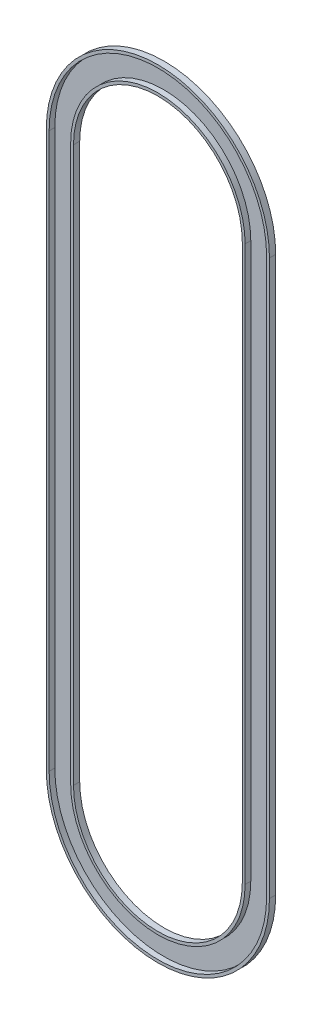
ISO-10303-21;
HEADER;
FILE_DESCRIPTION(('STEP AP214'),'2;1');
FILE_NAME('part.step','',(''),(''),'','','');
FILE_SCHEMA(('AUTOMOTIVE_DESIGN { 1 0 10303 214 1 1 1 1 }'));
ENDSEC;
DATA;
#1=APPLICATION_CONTEXT('core data for automotive mechanical design processes');
#2=APPLICATION_PROTOCOL_DEFINITION('international standard','automotive_design',2000,#1);
#3=PRODUCT_CONTEXT('',#1,'mechanical');
#4=PRODUCT('Part','Part','',(#3));
#5=PRODUCT_RELATED_PRODUCT_CATEGORY('part','',(#4));
#6=PRODUCT_DEFINITION_FORMATION('','',#4);
#7=PRODUCT_DEFINITION_CONTEXT('part definition',#1,'design');
#8=PRODUCT_DEFINITION('design','',#6,#7);
#9=PRODUCT_DEFINITION_SHAPE('','',#8);
#10=(LENGTH_UNIT() NAMED_UNIT(*) SI_UNIT(.MILLI.,.METRE.));
#11=(NAMED_UNIT(*) PLANE_ANGLE_UNIT() SI_UNIT($,.RADIAN.));
#12=(NAMED_UNIT(*) SI_UNIT($,.STERADIAN.) SOLID_ANGLE_UNIT());
#13=UNCERTAINTY_MEASURE_WITH_UNIT(LENGTH_MEASURE(1.E-05),#10,'distance_accuracy_value','');
#14=(GEOMETRIC_REPRESENTATION_CONTEXT(3) GLOBAL_UNCERTAINTY_ASSIGNED_CONTEXT((#13)) GLOBAL_UNIT_ASSIGNED_CONTEXT((#10,
#11,#12)) REPRESENTATION_CONTEXT('',''));
#15=CARTESIAN_POINT('',(0.,0.,0.));
#16=DIRECTION('',(0.,0.,1.));
#17=DIRECTION('',(1.,0.,0.));
#18=AXIS2_PLACEMENT_3D('',#15,#16,#17);
#19=CARTESIAN_POINT('',(0.,5402.16892981535,5.));
#20=DIRECTION('',(0.,0.,1.));
#21=DIRECTION('',(1.,0.,0.));
#22=AXIS2_PLACEMENT_3D('',#19,#20,#21);
#23=PLANE('',#22);
#24=CARTESIAN_POINT('',(0.,5402.16892981535,5.));
#25=DIRECTION('',(0.,0.,1.));
#26=DIRECTION('',(1.,0.,0.));
#27=AXIS2_PLACEMENT_3D('',#24,#25,#26);
#28=CIRCLE('',#27,960.);
#29=CARTESIAN_POINT('',(960.,5402.16892981535,5.));
#30=VERTEX_POINT('',#29);
#31=CARTESIAN_POINT('',(-960.,5402.16892981535,5.));
#32=VERTEX_POINT('',#31);
#33=EDGE_CURVE('E52',#30,#32,#28,.T.);
#34=ORIENTED_EDGE('',*,*,#33,.T.);
#35=DIRECTION('',(0.,-1.,0.));
#36=VECTOR('',#35,1.);
#37=CARTESIAN_POINT('',(-960.,5402.16892981535,5.));
#38=LINE('',#37,#36);
#39=CARTESIAN_POINT('',(-960.,505.168929815352,5.));
#40=VERTEX_POINT('',#39);
#41=EDGE_CURVE('E56',#32,#40,#38,.T.);
#42=ORIENTED_EDGE('',*,*,#41,.T.);
#43=CARTESIAN_POINT('',(5.99709537542459E-13,505.168929815352,5.));
#44=DIRECTION('',(0.,0.,1.));
#45=DIRECTION('',(1.,0.,0.));
#46=AXIS2_PLACEMENT_3D('',#43,#44,#45);
#47=CIRCLE('',#46,960.);
#48=CARTESIAN_POINT('',(960.000000000001,505.168929815352,5.));
#49=VERTEX_POINT('',#48);
#50=EDGE_CURVE('E178',#40,#49,#47,.T.);
#51=ORIENTED_EDGE('',*,*,#50,.T.);
#52=DIRECTION('',(0.,1.,0.));
#53=VECTOR('',#52,1.);
#54=CARTESIAN_POINT('',(960.000000000001,505.168929815352,5.));
#55=LINE('',#54,#53);
#56=EDGE_CURVE('E159',#49,#30,#55,.T.);
#57=ORIENTED_EDGE('',*,*,#56,.T.);
#58=EDGE_LOOP('',(#34,#42,#51,#57));
#59=FACE_BOUND('',#58,.T.);
#60=DIRECTION('',(0.,-1.,0.));
#61=VECTOR('',#60,1.);
#62=CARTESIAN_POINT('',(-770.,5402.16892981535,5.));
#63=LINE('',#62,#61);
#64=CARTESIAN_POINT('',(-770.,5402.16892981535,5.));
#65=VERTEX_POINT('',#64);
#66=CARTESIAN_POINT('',(-770.,505.168929815352,5.));
#67=VERTEX_POINT('',#66);
#68=EDGE_CURVE('E223',#65,#67,#63,.T.);
#69=ORIENTED_EDGE('',*,*,#68,.F.);
#70=CARTESIAN_POINT('',(0.,5402.16892981535,5.));
#71=DIRECTION('',(0.,0.,1.));
#72=DIRECTION('',(1.,0.,0.));
#73=AXIS2_PLACEMENT_3D('',#70,#71,#72);
#74=CIRCLE('',#73,770.);
#75=CARTESIAN_POINT('',(770.,5402.16892981535,5.));
#76=VERTEX_POINT('',#75);
#77=EDGE_CURVE('E209',#76,#65,#74,.T.);
#78=ORIENTED_EDGE('',*,*,#77,.F.);
#79=DIRECTION('',(0.,1.,0.));
#80=VECTOR('',#79,1.);
#81=CARTESIAN_POINT('',(770.000000000001,505.168929815352,5.));
#82=LINE('',#81,#80);
#83=CARTESIAN_POINT('',(770.000000000001,505.168929815352,5.));
#84=VERTEX_POINT('',#83);
#85=EDGE_CURVE('E214',#84,#76,#82,.T.);
#86=ORIENTED_EDGE('',*,*,#85,.F.);
#87=CARTESIAN_POINT('',(5.99709537542459E-13,505.168929815352,5.));
#88=DIRECTION('',(0.,0.,1.));
#89=DIRECTION('',(1.,0.,0.));
#90=AXIS2_PLACEMENT_3D('',#87,#88,#89);
#91=CIRCLE('',#90,770.);
#92=EDGE_CURVE('E225',#67,#84,#91,.T.);
#93=ORIENTED_EDGE('',*,*,#92,.F.);
#94=EDGE_LOOP('',(#69,#78,#86,#93));
#95=FACE_BOUND('',#94,.T.);
#96=ADVANCED_FACE('F37',(#59,#95),#23,.T.);
#97=CARTESIAN_POINT('',(0.,5402.16892981535,0.));
#98=DIRECTION('',(0.,0.,1.));
#99=DIRECTION('',(1.,0.,0.));
#100=AXIS2_PLACEMENT_3D('',#97,#98,#99);
#101=PLANE('',#100);
#102=CARTESIAN_POINT('',(0.,5402.16892981535,0.));
#103=DIRECTION('',(0.,0.,1.));
#104=DIRECTION('',(1.,0.,0.));
#105=AXIS2_PLACEMENT_3D('',#102,#103,#104);
#106=CIRCLE('',#105,985.);
#107=CARTESIAN_POINT('',(985.,5402.16892981535,0.));
#108=VERTEX_POINT('',#107);
#109=CARTESIAN_POINT('',(-985.,5402.16892981535,0.));
#110=VERTEX_POINT('',#109);
#111=EDGE_CURVE('E260',#108,#110,#106,.T.);
#112=ORIENTED_EDGE('',*,*,#111,.F.);
#113=DIRECTION('',(0.,1.,0.));
#114=VECTOR('',#113,1.);
#115=CARTESIAN_POINT('',(985.,5402.16892981535,0.));
#116=LINE('',#115,#114);
#117=CARTESIAN_POINT('',(985.000000000001,505.168929815352,0.));
#118=VERTEX_POINT('',#117);
#119=EDGE_CURVE('E267',#118,#108,#116,.T.);
#120=ORIENTED_EDGE('',*,*,#119,.F.);
#121=CARTESIAN_POINT('',(5.99709537542459E-13,505.168929815352,0.));
#122=DIRECTION('',(0.,0.,1.));
#123=DIRECTION('',(1.,0.,0.));
#124=AXIS2_PLACEMENT_3D('',#121,#122,#123);
#125=CIRCLE('',#124,985.);
#126=CARTESIAN_POINT('',(-985.,505.168929815352,0.));
#127=VERTEX_POINT('',#126);
#128=EDGE_CURVE('E265',#127,#118,#125,.T.);
#129=ORIENTED_EDGE('',*,*,#128,.F.);
#130=DIRECTION('',(0.,-1.,0.));
#131=VECTOR('',#130,1.);
#132=CARTESIAN_POINT('',(-985.,5402.16892981535,0.));
#133=LINE('',#132,#131);
#134=EDGE_CURVE('E263',#110,#127,#133,.T.);
#135=ORIENTED_EDGE('',*,*,#134,.F.);
#136=EDGE_LOOP('',(#112,#120,#129,#135));
#137=FACE_BOUND('',#136,.T.);
#138=CARTESIAN_POINT('',(0.,5402.16892981535,0.));
#139=DIRECTION('',(0.,0.,1.));
#140=DIRECTION('',(1.,0.,0.));
#141=AXIS2_PLACEMENT_3D('',#138,#139,#140);
#142=CIRCLE('',#141,745.);
#143=CARTESIAN_POINT('',(745.,5402.16892981535,0.));
#144=VERTEX_POINT('',#143);
#145=CARTESIAN_POINT('',(-745.,5402.16892981535,0.));
#146=VERTEX_POINT('',#145);
#147=EDGE_CURVE('E238',#144,#146,#142,.T.);
#148=ORIENTED_EDGE('',*,*,#147,.T.);
#149=DIRECTION('',(0.,-1.,0.));
#150=VECTOR('',#149,1.);
#151=CARTESIAN_POINT('',(-745.,5402.16892981535,0.));
#152=LINE('',#151,#150);
#153=CARTESIAN_POINT('',(-745.,505.168929815352,0.));
#154=VERTEX_POINT('',#153);
#155=EDGE_CURVE('E241',#146,#154,#152,.T.);
#156=ORIENTED_EDGE('',*,*,#155,.T.);
#157=CARTESIAN_POINT('',(5.99709537542459E-13,505.168929815352,0.));
#158=DIRECTION('',(0.,0.,1.));
#159=DIRECTION('',(1.,0.,0.));
#160=AXIS2_PLACEMENT_3D('',#157,#158,#159);
#161=CIRCLE('',#160,745.);
#162=CARTESIAN_POINT('',(745.000000000001,505.168929815352,0.));
#163=VERTEX_POINT('',#162);
#164=EDGE_CURVE('E244',#154,#163,#161,.T.);
#165=ORIENTED_EDGE('',*,*,#164,.T.);
#166=DIRECTION('',(0.,1.,0.));
#167=VECTOR('',#166,1.);
#168=CARTESIAN_POINT('',(745.,5402.16892981535,0.));
#169=LINE('',#168,#167);
#170=EDGE_CURVE('E247',#163,#144,#169,.T.);
#171=ORIENTED_EDGE('',*,*,#170,.T.);
#172=EDGE_LOOP('',(#148,#156,#165,#171));
#173=FACE_BOUND('',#172,.T.);
#174=ADVANCED_FACE('F284',(#137,#173),#101,.F.);
#175=CARTESIAN_POINT('',(0.,5402.16892981535,5.));
#176=DIRECTION('',(0.,0.,-1.));
#177=DIRECTION('',(-1.,0.,0.));
#178=AXIS2_PLACEMENT_3D('',#175,#176,#177);
#179=CYLINDRICAL_SURFACE('',#178,985.);
#180=ORIENTED_EDGE('',*,*,#111,.T.);
#181=DIRECTION('',(0.,0.,-1.));
#182=VECTOR('',#181,1.);
#183=CARTESIAN_POINT('',(-985.,5402.16892981535,5.));
#184=LINE('',#183,#182);
#185=CARTESIAN_POINT('',(-985.,5402.16892981535,55.));
#186=VERTEX_POINT('',#185);
#187=EDGE_CURVE('E11',#186,#110,#184,.T.);
#188=ORIENTED_EDGE('',*,*,#187,.F.);
#189=CARTESIAN_POINT('',(0.,5402.16892981535,55.));
#190=DIRECTION('',(0.,0.,1.));
#191=DIRECTION('',(1.,0.,0.));
#192=AXIS2_PLACEMENT_3D('',#189,#190,#191);
#193=CIRCLE('',#192,985.);
#194=CARTESIAN_POINT('',(985.,5402.16892981535,55.));
#195=VERTEX_POINT('',#194);
#196=EDGE_CURVE('E191',#195,#186,#193,.T.);
#197=ORIENTED_EDGE('',*,*,#196,.F.);
#198=DIRECTION('',(0.,0.,-1.));
#199=VECTOR('',#198,1.);
#200=CARTESIAN_POINT('',(985.,5402.16892981535,5.));
#201=LINE('',#200,#199);
#202=EDGE_CURVE('E269',#195,#108,#201,.T.);
#203=ORIENTED_EDGE('',*,*,#202,.T.);
#204=EDGE_LOOP('',(#180,#188,#197,#203));
#205=FACE_BOUND('',#204,.T.);
#206=ADVANCED_FACE('F39',(#205),#179,.T.);
#207=CARTESIAN_POINT('',(-985.,5402.16892981535,5.));
#208=DIRECTION('',(1.,0.,0.));
#209=DIRECTION('',(0.,1.,0.));
#210=AXIS2_PLACEMENT_3D('',#207,#208,#209);
#211=PLANE('',#210);
#212=ORIENTED_EDGE('',*,*,#134,.T.);
#213=DIRECTION('',(0.,0.,-1.));
#214=VECTOR('',#213,1.);
#215=CARTESIAN_POINT('',(-985.,505.168929815352,5.));
#216=LINE('',#215,#214);
#217=CARTESIAN_POINT('',(-985.,505.168929815352,55.));
#218=VERTEX_POINT('',#217);
#219=EDGE_CURVE('E45',#218,#127,#216,.T.);
#220=ORIENTED_EDGE('',*,*,#219,.F.);
#221=DIRECTION('',(0.,-1.,0.));
#222=VECTOR('',#221,1.);
#223=CARTESIAN_POINT('',(-985.,5402.16892981535,55.));
#224=LINE('',#223,#222);
#225=EDGE_CURVE('E194',#186,#218,#224,.T.);
#226=ORIENTED_EDGE('',*,*,#225,.F.);
#227=ORIENTED_EDGE('',*,*,#187,.T.);
#228=EDGE_LOOP('',(#212,#220,#226,#227));
#229=FACE_BOUND('',#228,.T.);
#230=ADVANCED_FACE('F292',(#229),#211,.F.);
#231=CARTESIAN_POINT('',(5.99709537542459E-13,505.168929815352,5.));
#232=DIRECTION('',(0.,0.,-1.));
#233=DIRECTION('',(-1.,0.,0.));
#234=AXIS2_PLACEMENT_3D('',#231,#232,#233);
#235=CYLINDRICAL_SURFACE('',#234,985.);
#236=ORIENTED_EDGE('',*,*,#128,.T.);
#237=DIRECTION('',(0.,0.,-1.));
#238=VECTOR('',#237,1.);
#239=CARTESIAN_POINT('',(985.000000000001,505.168929815352,5.));
#240=LINE('',#239,#238);
#241=CARTESIAN_POINT('',(985.000000000001,505.168929815352,55.));
#242=VERTEX_POINT('',#241);
#243=EDGE_CURVE('E272',#242,#118,#240,.T.);
#244=ORIENTED_EDGE('',*,*,#243,.F.);
#245=CARTESIAN_POINT('',(5.99709537542459E-13,505.168929815352,55.));
#246=DIRECTION('',(0.,0.,1.));
#247=DIRECTION('',(1.,0.,0.));
#248=AXIS2_PLACEMENT_3D('',#245,#246,#247);
#249=CIRCLE('',#248,985.);
#250=EDGE_CURVE('E164',#218,#242,#249,.T.);
#251=ORIENTED_EDGE('',*,*,#250,.F.);
#252=ORIENTED_EDGE('',*,*,#219,.T.);
#253=EDGE_LOOP('',(#236,#244,#251,#252));
#254=FACE_BOUND('',#253,.T.);
#255=ADVANCED_FACE('F278',(#254),#235,.T.);
#256=CARTESIAN_POINT('',(985.,5402.16892981535,5.));
#257=DIRECTION('',(-1.,0.,0.));
#258=DIRECTION('',(0.,-1.,0.));
#259=AXIS2_PLACEMENT_3D('',#256,#257,#258);
#260=PLANE('',#259);
#261=ORIENTED_EDGE('',*,*,#119,.T.);
#262=ORIENTED_EDGE('',*,*,#202,.F.);
#263=DIRECTION('',(0.,1.,0.));
#264=VECTOR('',#263,1.);
#265=CARTESIAN_POINT('',(985.000000000001,505.168929815352,55.));
#266=LINE('',#265,#264);
#267=EDGE_CURVE('E188',#242,#195,#266,.T.);
#268=ORIENTED_EDGE('',*,*,#267,.F.);
#269=ORIENTED_EDGE('',*,*,#243,.T.);
#270=EDGE_LOOP('',(#261,#262,#268,#269));
#271=FACE_BOUND('',#270,.T.);
#272=ADVANCED_FACE('F287',(#271),#260,.F.);
#273=CARTESIAN_POINT('',(0.,5402.16892981535,5.));
#274=DIRECTION('',(0.,0.,-1.));
#275=DIRECTION('',(-1.,0.,0.));
#276=AXIS2_PLACEMENT_3D('',#273,#274,#275);
#277=CYLINDRICAL_SURFACE('',#276,745.);
#278=ORIENTED_EDGE('',*,*,#147,.F.);
#279=DIRECTION('',(0.,0.,-1.));
#280=VECTOR('',#279,1.);
#281=CARTESIAN_POINT('',(745.,5402.16892981535,5.));
#282=LINE('',#281,#280);
#283=CARTESIAN_POINT('',(745.,5402.16892981535,55.));
#284=VERTEX_POINT('',#283);
#285=EDGE_CURVE('E250',#284,#144,#282,.T.);
#286=ORIENTED_EDGE('',*,*,#285,.F.);
#287=CARTESIAN_POINT('',(0.,5402.16892981535,55.));
#288=DIRECTION('',(0.,0.,1.));
#289=DIRECTION('',(1.,0.,0.));
#290=AXIS2_PLACEMENT_3D('',#287,#288,#289);
#291=CIRCLE('',#290,745.);
#292=CARTESIAN_POINT('',(-745.,5402.16892981535,55.));
#293=VERTEX_POINT('',#292);
#294=EDGE_CURVE('E203',#284,#293,#291,.T.);
#295=ORIENTED_EDGE('',*,*,#294,.T.);
#296=DIRECTION('',(0.,0.,-1.));
#297=VECTOR('',#296,1.);
#298=CARTESIAN_POINT('',(-745.,5402.16892981535,5.));
#299=LINE('',#298,#297);
#300=EDGE_CURVE('E257',#293,#146,#299,.T.);
#301=ORIENTED_EDGE('',*,*,#300,.T.);
#302=EDGE_LOOP('',(#278,#286,#295,#301));
#303=FACE_BOUND('',#302,.T.);
#304=ADVANCED_FACE('F307',(#303),#277,.F.);
#305=CARTESIAN_POINT('',(-745.,5402.16892981535,5.));
#306=DIRECTION('',(1.,0.,0.));
#307=DIRECTION('',(0.,1.,0.));
#308=AXIS2_PLACEMENT_3D('',#305,#306,#307);
#309=PLANE('',#308);
#310=ORIENTED_EDGE('',*,*,#155,.F.);
#311=ORIENTED_EDGE('',*,*,#300,.F.);
#312=DIRECTION('',(0.,-1.,0.));
#313=VECTOR('',#312,1.);
#314=CARTESIAN_POINT('',(-745.,5402.16892981535,55.));
#315=LINE('',#314,#313);
#316=CARTESIAN_POINT('',(-745.,505.168929815352,55.));
#317=VERTEX_POINT('',#316);
#318=EDGE_CURVE('E206',#293,#317,#315,.T.);
#319=ORIENTED_EDGE('',*,*,#318,.T.);
#320=DIRECTION('',(0.,0.,-1.));
#321=VECTOR('',#320,1.);
#322=CARTESIAN_POINT('',(-745.,505.168929815352,5.));
#323=LINE('',#322,#321);
#324=EDGE_CURVE('E255',#317,#154,#323,.T.);
#325=ORIENTED_EDGE('',*,*,#324,.T.);
#326=EDGE_LOOP('',(#310,#311,#319,#325));
#327=FACE_BOUND('',#326,.T.);
#328=ADVANCED_FACE('F314',(#327),#309,.T.);
#329=CARTESIAN_POINT('',(5.99709537542459E-13,505.168929815352,5.));
#330=DIRECTION('',(0.,0.,-1.));
#331=DIRECTION('',(-1.,0.,0.));
#332=AXIS2_PLACEMENT_3D('',#329,#330,#331);
#333=CYLINDRICAL_SURFACE('',#332,745.);
#334=ORIENTED_EDGE('',*,*,#164,.F.);
#335=ORIENTED_EDGE('',*,*,#324,.F.);
#336=CARTESIAN_POINT('',(5.99709537542459E-13,505.168929815352,55.));
#337=DIRECTION('',(0.,0.,1.));
#338=DIRECTION('',(1.,0.,0.));
#339=AXIS2_PLACEMENT_3D('',#336,#337,#338);
#340=CIRCLE('',#339,745.);
#341=CARTESIAN_POINT('',(745.000000000001,505.168929815352,55.));
#342=VERTEX_POINT('',#341);
#343=EDGE_CURVE('E197',#317,#342,#340,.T.);
#344=ORIENTED_EDGE('',*,*,#343,.T.);
#345=DIRECTION('',(0.,0.,-1.));
#346=VECTOR('',#345,1.);
#347=CARTESIAN_POINT('',(745.000000000001,505.168929815352,5.));
#348=LINE('',#347,#346);
#349=EDGE_CURVE('E253',#342,#163,#348,.T.);
#350=ORIENTED_EDGE('',*,*,#349,.T.);
#351=EDGE_LOOP('',(#334,#335,#344,#350));
#352=FACE_BOUND('',#351,.T.);
#353=ADVANCED_FACE('F319',(#352),#333,.F.);
#354=CARTESIAN_POINT('',(745.,5402.16892981535,5.));
#355=DIRECTION('',(-1.,0.,0.));
#356=DIRECTION('',(0.,-1.,0.));
#357=AXIS2_PLACEMENT_3D('',#354,#355,#356);
#358=PLANE('',#357);
#359=ORIENTED_EDGE('',*,*,#170,.F.);
#360=ORIENTED_EDGE('',*,*,#349,.F.);
#361=DIRECTION('',(0.,1.,0.));
#362=VECTOR('',#361,1.);
#363=CARTESIAN_POINT('',(745.000000000001,505.168929815352,55.));
#364=LINE('',#363,#362);
#365=EDGE_CURVE('E200',#342,#284,#364,.T.);
#366=ORIENTED_EDGE('',*,*,#365,.T.);
#367=ORIENTED_EDGE('',*,*,#285,.T.);
#368=EDGE_LOOP('',(#359,#360,#366,#367));
#369=FACE_BOUND('',#368,.T.);
#370=ADVANCED_FACE('F323',(#369),#358,.T.);
#371=CARTESIAN_POINT('',(0.,5402.16892981535,55.));
#372=DIRECTION('',(0.,0.,1.));
#373=DIRECTION('',(1.,0.,0.));
#374=AXIS2_PLACEMENT_3D('',#371,#372,#373);
#375=PLANE('',#374);
#376=CARTESIAN_POINT('',(0.,5402.16892981535,55.));
#377=DIRECTION('',(0.,0.,1.));
#378=DIRECTION('',(1.,0.,0.));
#379=AXIS2_PLACEMENT_3D('',#376,#377,#378);
#380=CIRCLE('',#379,770.);
#381=CARTESIAN_POINT('',(770.,5402.16892981535,55.));
#382=VERTEX_POINT('',#381);
#383=CARTESIAN_POINT('',(-770.,5402.16892981535,55.));
#384=VERTEX_POINT('',#383);
#385=EDGE_CURVE('E210',#382,#384,#380,.T.);
#386=ORIENTED_EDGE('',*,*,#385,.T.);
#387=DIRECTION('',(0.,-1.,0.));
#388=VECTOR('',#387,1.);
#389=CARTESIAN_POINT('',(-770.,5402.16892981535,55.));
#390=LINE('',#389,#388);
#391=CARTESIAN_POINT('',(-770.,505.168929815352,55.));
#392=VERTEX_POINT('',#391);
#393=EDGE_CURVE('E213',#384,#392,#390,.T.);
#394=ORIENTED_EDGE('',*,*,#393,.T.);
#395=CARTESIAN_POINT('',(5.99709537542459E-13,505.168929815352,55.));
#396=DIRECTION('',(0.,0.,1.));
#397=DIRECTION('',(1.,0.,0.));
#398=AXIS2_PLACEMENT_3D('',#395,#396,#397);
#399=CIRCLE('',#398,770.);
#400=CARTESIAN_POINT('',(770.000000000001,505.168929815352,55.));
#401=VERTEX_POINT('',#400);
#402=EDGE_CURVE('E216',#392,#401,#399,.T.);
#403=ORIENTED_EDGE('',*,*,#402,.T.);
#404=DIRECTION('',(0.,1.,0.));
#405=VECTOR('',#404,1.);
#406=CARTESIAN_POINT('',(770.000000000001,505.168929815352,55.));
#407=LINE('',#406,#405);
#408=EDGE_CURVE('E218',#401,#382,#407,.T.);
#409=ORIENTED_EDGE('',*,*,#408,.T.);
#410=EDGE_LOOP('',(#386,#394,#403,#409));
#411=FACE_BOUND('',#410,.T.);
#412=ORIENTED_EDGE('',*,*,#365,.F.);
#413=ORIENTED_EDGE('',*,*,#343,.F.);
#414=ORIENTED_EDGE('',*,*,#318,.F.);
#415=ORIENTED_EDGE('',*,*,#294,.F.);
#416=EDGE_LOOP('',(#412,#413,#414,#415));
#417=FACE_BOUND('',#416,.T.);
#418=ADVANCED_FACE('F331',(#411,#417),#375,.T.);
#419=CARTESIAN_POINT('',(0.,5402.16892981535,55.));
#420=DIRECTION('',(0.,0.,-1.));
#421=DIRECTION('',(-1.,0.,0.));
#422=AXIS2_PLACEMENT_3D('',#419,#420,#421);
#423=CYLINDRICAL_SURFACE('',#422,770.);
#424=ORIENTED_EDGE('',*,*,#77,.T.);
#425=DIRECTION('',(0.,0.,-1.));
#426=VECTOR('',#425,1.);
#427=CARTESIAN_POINT('',(-770.,5402.16892981535,55.));
#428=LINE('',#427,#426);
#429=EDGE_CURVE('E236',#384,#65,#428,.T.);
#430=ORIENTED_EDGE('',*,*,#429,.F.);
#431=ORIENTED_EDGE('',*,*,#385,.F.);
#432=DIRECTION('',(0.,0.,-1.));
#433=VECTOR('',#432,1.);
#434=CARTESIAN_POINT('',(770.,5402.16892981535,55.));
#435=LINE('',#434,#433);
#436=EDGE_CURVE('E220',#382,#76,#435,.T.);
#437=ORIENTED_EDGE('',*,*,#436,.T.);
#438=EDGE_LOOP('',(#424,#430,#431,#437));
#439=FACE_BOUND('',#438,.T.);
#440=ADVANCED_FACE('F333',(#439),#423,.T.);
#441=CARTESIAN_POINT('',(-770.,5402.16892981535,55.));
#442=DIRECTION('',(1.,0.,0.));
#443=DIRECTION('',(0.,1.,0.));
#444=AXIS2_PLACEMENT_3D('',#441,#442,#443);
#445=PLANE('',#444);
#446=ORIENTED_EDGE('',*,*,#68,.T.);
#447=DIRECTION('',(0.,0.,-1.));
#448=VECTOR('',#447,1.);
#449=CARTESIAN_POINT('',(-770.,505.168929815352,55.));
#450=LINE('',#449,#448);
#451=EDGE_CURVE('E233',#392,#67,#450,.T.);
#452=ORIENTED_EDGE('',*,*,#451,.F.);
#453=ORIENTED_EDGE('',*,*,#393,.F.);
#454=ORIENTED_EDGE('',*,*,#429,.T.);
#455=EDGE_LOOP('',(#446,#452,#453,#454));
#456=FACE_BOUND('',#455,.T.);
#457=ADVANCED_FACE('F340',(#456),#445,.F.);
#458=CARTESIAN_POINT('',(5.99709537542459E-13,505.168929815352,55.));
#459=DIRECTION('',(0.,0.,-1.));
#460=DIRECTION('',(-1.,0.,0.));
#461=AXIS2_PLACEMENT_3D('',#458,#459,#460);
#462=CYLINDRICAL_SURFACE('',#461,770.);
#463=ORIENTED_EDGE('',*,*,#92,.T.);
#464=DIRECTION('',(0.,0.,-1.));
#465=VECTOR('',#464,1.);
#466=CARTESIAN_POINT('',(770.000000000001,505.168929815352,55.));
#467=LINE('',#466,#465);
#468=EDGE_CURVE('E231',#401,#84,#467,.T.);
#469=ORIENTED_EDGE('',*,*,#468,.F.);
#470=ORIENTED_EDGE('',*,*,#402,.F.);
#471=ORIENTED_EDGE('',*,*,#451,.T.);
#472=EDGE_LOOP('',(#463,#469,#470,#471));
#473=FACE_BOUND('',#472,.T.);
#474=ADVANCED_FACE('F350',(#473),#462,.T.);
#475=CARTESIAN_POINT('',(770.000000000001,505.168929815352,55.));
#476=DIRECTION('',(-1.,0.,0.));
#477=DIRECTION('',(0.,-1.,0.));
#478=AXIS2_PLACEMENT_3D('',#475,#476,#477);
#479=PLANE('',#478);
#480=ORIENTED_EDGE('',*,*,#85,.T.);
#481=ORIENTED_EDGE('',*,*,#436,.F.);
#482=ORIENTED_EDGE('',*,*,#408,.F.);
#483=ORIENTED_EDGE('',*,*,#468,.T.);
#484=EDGE_LOOP('',(#480,#481,#482,#483));
#485=FACE_BOUND('',#484,.T.);
#486=ADVANCED_FACE('F347',(#485),#479,.F.);
#487=CARTESIAN_POINT('',(5.99709537542459E-13,505.168929815352,55.));
#488=DIRECTION('',(0.,0.,1.));
#489=DIRECTION('',(1.,0.,0.));
#490=AXIS2_PLACEMENT_3D('',#487,#488,#489);
#491=PLANE('',#490);
#492=ORIENTED_EDGE('',*,*,#250,.T.);
#493=ORIENTED_EDGE('',*,*,#267,.T.);
#494=ORIENTED_EDGE('',*,*,#196,.T.);
#495=ORIENTED_EDGE('',*,*,#225,.T.);
#496=EDGE_LOOP('',(#492,#493,#494,#495));
#497=FACE_BOUND('',#496,.T.);
#498=DIRECTION('',(0.,-1.,0.));
#499=VECTOR('',#498,1.);
#500=CARTESIAN_POINT('',(-960.,5402.16892981535,55.));
#501=LINE('',#500,#499);
#502=CARTESIAN_POINT('',(-960.,5402.16892981535,55.));
#503=VERTEX_POINT('',#502);
#504=CARTESIAN_POINT('',(-960.,505.168929815352,55.));
#505=VERTEX_POINT('',#504);
#506=EDGE_CURVE('E158',#503,#505,#501,.T.);
#507=ORIENTED_EDGE('',*,*,#506,.F.);
#508=CARTESIAN_POINT('',(0.,5402.16892981535,55.));
#509=DIRECTION('',(0.,0.,1.));
#510=DIRECTION('',(1.,0.,0.));
#511=AXIS2_PLACEMENT_3D('',#508,#509,#510);
#512=CIRCLE('',#511,960.);
#513=CARTESIAN_POINT('',(960.,5402.16892981535,55.));
#514=VERTEX_POINT('',#513);
#515=EDGE_CURVE('E149',#514,#503,#512,.T.);
#516=ORIENTED_EDGE('',*,*,#515,.F.);
#517=DIRECTION('',(0.,1.,0.));
#518=VECTOR('',#517,1.);
#519=CARTESIAN_POINT('',(960.000000000001,505.168929815352,55.));
#520=LINE('',#519,#518);
#521=CARTESIAN_POINT('',(960.000000000001,505.168929815352,55.));
#522=VERTEX_POINT('',#521);
#523=EDGE_CURVE('E172',#522,#514,#520,.T.);
#524=ORIENTED_EDGE('',*,*,#523,.F.);
#525=CARTESIAN_POINT('',(5.99709537542459E-13,505.168929815352,55.));
#526=DIRECTION('',(0.,0.,1.));
#527=DIRECTION('',(1.,0.,0.));
#528=AXIS2_PLACEMENT_3D('',#525,#526,#527);
#529=CIRCLE('',#528,960.);
#530=EDGE_CURVE('E170',#505,#522,#529,.T.);
#531=ORIENTED_EDGE('',*,*,#530,.F.);
#532=EDGE_LOOP('',(#507,#516,#524,#531));
#533=FACE_BOUND('',#532,.T.);
#534=ADVANCED_FACE('F168',(#497,#533),#491,.T.);
#535=CARTESIAN_POINT('',(0.,5402.16892981535,55.));
#536=DIRECTION('',(0.,0.,-1.));
#537=DIRECTION('',(-1.,0.,0.));
#538=AXIS2_PLACEMENT_3D('',#535,#536,#537);
#539=CYLINDRICAL_SURFACE('',#538,960.);
#540=ORIENTED_EDGE('',*,*,#33,.F.);
#541=DIRECTION('',(0.,0.,-1.));
#542=VECTOR('',#541,1.);
#543=CARTESIAN_POINT('',(960.,5402.16892981535,55.));
#544=LINE('',#543,#542);
#545=EDGE_CURVE('E154',#514,#30,#544,.T.);
#546=ORIENTED_EDGE('',*,*,#545,.F.);
#547=ORIENTED_EDGE('',*,*,#515,.T.);
#548=DIRECTION('',(0.,0.,-1.));
#549=VECTOR('',#548,1.);
#550=CARTESIAN_POINT('',(-960.,5402.16892981535,55.));
#551=LINE('',#550,#549);
#552=EDGE_CURVE('E152',#503,#32,#551,.T.);
#553=ORIENTED_EDGE('',*,*,#552,.T.);
#554=EDGE_LOOP('',(#540,#546,#547,#553));
#555=FACE_BOUND('',#554,.T.);
#556=ADVANCED_FACE('F151',(#555),#539,.F.);
#557=CARTESIAN_POINT('',(-960.,5402.16892981535,55.));
#558=DIRECTION('',(1.,0.,0.));
#559=DIRECTION('',(0.,1.,0.));
#560=AXIS2_PLACEMENT_3D('',#557,#558,#559);
#561=PLANE('',#560);
#562=ORIENTED_EDGE('',*,*,#41,.F.);
#563=ORIENTED_EDGE('',*,*,#552,.F.);
#564=ORIENTED_EDGE('',*,*,#506,.T.);
#565=DIRECTION('',(0.,0.,-1.));
#566=VECTOR('',#565,1.);
#567=CARTESIAN_POINT('',(-960.,505.168929815352,55.));
#568=LINE('',#567,#566);
#569=EDGE_CURVE('E165',#505,#40,#568,.T.);
#570=ORIENTED_EDGE('',*,*,#569,.T.);
#571=EDGE_LOOP('',(#562,#563,#564,#570));
#572=FACE_BOUND('',#571,.T.);
#573=ADVANCED_FACE('F162',(#572),#561,.T.);
#574=CARTESIAN_POINT('',(5.99709537542459E-13,505.168929815352,55.));
#575=DIRECTION('',(0.,0.,-1.));
#576=DIRECTION('',(-1.,0.,0.));
#577=AXIS2_PLACEMENT_3D('',#574,#575,#576);
#578=CYLINDRICAL_SURFACE('',#577,960.);
#579=ORIENTED_EDGE('',*,*,#50,.F.);
#580=ORIENTED_EDGE('',*,*,#569,.F.);
#581=ORIENTED_EDGE('',*,*,#530,.T.);
#582=DIRECTION('',(0.,0.,-1.));
#583=VECTOR('',#582,1.);
#584=CARTESIAN_POINT('',(960.000000000001,505.168929815352,55.));
#585=LINE('',#584,#583);
#586=EDGE_CURVE('E182',#522,#49,#585,.T.);
#587=ORIENTED_EDGE('',*,*,#586,.T.);
#588=EDGE_LOOP('',(#579,#580,#581,#587));
#589=FACE_BOUND('',#588,.T.);
#590=ADVANCED_FACE('F448',(#589),#578,.F.);
#591=CARTESIAN_POINT('',(960.000000000001,505.168929815352,55.));
#592=DIRECTION('',(-1.,0.,0.));
#593=DIRECTION('',(0.,-1.,0.));
#594=AXIS2_PLACEMENT_3D('',#591,#592,#593);
#595=PLANE('',#594);
#596=ORIENTED_EDGE('',*,*,#56,.F.);
#597=ORIENTED_EDGE('',*,*,#586,.F.);
#598=ORIENTED_EDGE('',*,*,#523,.T.);
#599=ORIENTED_EDGE('',*,*,#545,.T.);
#600=EDGE_LOOP('',(#596,#597,#598,#599));
#601=FACE_BOUND('',#600,.T.);
#602=ADVANCED_FACE('F457',(#601),#595,.T.);
#603=CLOSED_SHELL('',(#96,#174,#206,#230,#255,#272,#304,#328,#353,#370,#418,#440,#457,#474,#486,
#534,#556,#573,#590,#602));
#604=MANIFOLD_SOLID_BREP('B2',#603);
#605=ADVANCED_BREP_SHAPE_REPRESENTATION('',(#18,#604),#14);
#606=SHAPE_DEFINITION_REPRESENTATION(#9,#605);
ENDSEC;
END-ISO-10303-21;
